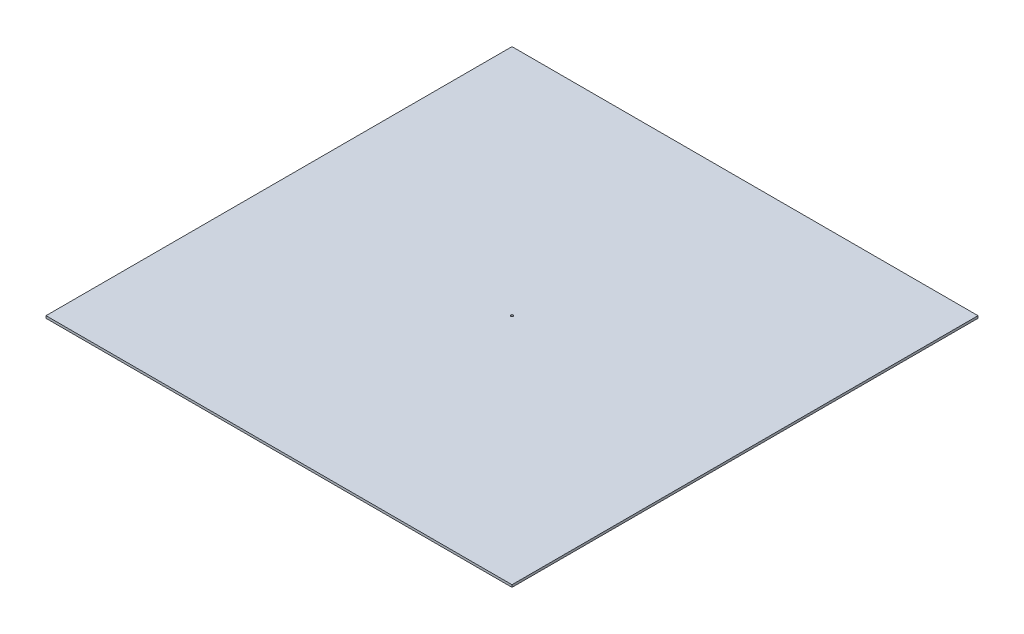
ISO-10303-21;
HEADER;
FILE_DESCRIPTION(('STEP AP214'),'2;1');
FILE_NAME('part.step','',(''),(''),'','','');
FILE_SCHEMA(('AUTOMOTIVE_DESIGN { 1 0 10303 214 1 1 1 1 }'));
ENDSEC;
DATA;
#1=APPLICATION_CONTEXT('core data for automotive mechanical design processes');
#2=APPLICATION_PROTOCOL_DEFINITION('international standard','automotive_design',2000,#1);
#3=PRODUCT_CONTEXT('',#1,'mechanical');
#4=PRODUCT('Part','Part','',(#3));
#5=PRODUCT_RELATED_PRODUCT_CATEGORY('part','',(#4));
#6=PRODUCT_DEFINITION_FORMATION('','',#4);
#7=PRODUCT_DEFINITION_CONTEXT('part definition',#1,'design');
#8=PRODUCT_DEFINITION('design','',#6,#7);
#9=PRODUCT_DEFINITION_SHAPE('','',#8);
#10=(LENGTH_UNIT() NAMED_UNIT(*) SI_UNIT(.MILLI.,.METRE.));
#11=(NAMED_UNIT(*) PLANE_ANGLE_UNIT() SI_UNIT($,.RADIAN.));
#12=(NAMED_UNIT(*) SI_UNIT($,.STERADIAN.) SOLID_ANGLE_UNIT());
#13=UNCERTAINTY_MEASURE_WITH_UNIT(LENGTH_MEASURE(1.E-05),#10,'distance_accuracy_value','');
#14=(GEOMETRIC_REPRESENTATION_CONTEXT(3) GLOBAL_UNCERTAINTY_ASSIGNED_CONTEXT((#13)) GLOBAL_UNIT_ASSIGNED_CONTEXT((#10,
#11,#12)) REPRESENTATION_CONTEXT('',''));
#15=CARTESIAN_POINT('',(0.,0.,0.));
#16=DIRECTION('',(0.,0.,1.));
#17=DIRECTION('',(1.,0.,0.));
#18=AXIS2_PLACEMENT_3D('',#15,#16,#17);
#19=CARTESIAN_POINT('',(1000.,10.,-1000.));
#20=DIRECTION('',(-1.,0.,0.));
#21=DIRECTION('',(0.,0.,1.));
#22=AXIS2_PLACEMENT_3D('',#19,#20,#21);
#23=PLANE('',#22);
#24=DIRECTION('',(0.,0.,-1.));
#25=VECTOR('',#24,1.);
#26=CARTESIAN_POINT('',(1000.,0.,-1000.));
#27=LINE('',#26,#25);
#28=CARTESIAN_POINT('',(1000.,0.,1000.));
#29=VERTEX_POINT('',#28);
#30=CARTESIAN_POINT('',(1000.,0.,-1000.));
#31=VERTEX_POINT('',#30);
#32=EDGE_CURVE('E96',#29,#31,#27,.T.);
#33=ORIENTED_EDGE('',*,*,#32,.T.);
#34=DIRECTION('',(0.,-1.,0.));
#35=VECTOR('',#34,1.);
#36=CARTESIAN_POINT('',(1000.,10.,-1000.));
#37=LINE('',#36,#35);
#38=CARTESIAN_POINT('',(1000.,10.,-1000.));
#39=VERTEX_POINT('',#38);
#40=EDGE_CURVE('E11',#39,#31,#37,.T.);
#41=ORIENTED_EDGE('',*,*,#40,.F.);
#42=DIRECTION('',(0.,0.,-1.));
#43=VECTOR('',#42,1.);
#44=CARTESIAN_POINT('',(1000.,10.,-1000.));
#45=LINE('',#44,#43);
#46=CARTESIAN_POINT('',(1000.,10.,1000.));
#47=VERTEX_POINT('',#46);
#48=EDGE_CURVE('E84',#47,#39,#45,.T.);
#49=ORIENTED_EDGE('',*,*,#48,.F.);
#50=DIRECTION('',(0.,-1.,0.));
#51=VECTOR('',#50,1.);
#52=CARTESIAN_POINT('',(1000.,10.,1000.));
#53=LINE('',#52,#51);
#54=EDGE_CURVE('E92',#47,#29,#53,.T.);
#55=ORIENTED_EDGE('',*,*,#54,.T.);
#56=EDGE_LOOP('',(#33,#41,#49,#55));
#57=FACE_BOUND('',#56,.T.);
#58=ADVANCED_FACE('F33',(#57),#23,.F.);
#59=CARTESIAN_POINT('',(-1000.,10.,-1000.));
#60=DIRECTION('',(0.,0.,1.));
#61=DIRECTION('',(1.,0.,0.));
#62=AXIS2_PLACEMENT_3D('',#59,#60,#61);
#63=PLANE('',#62);
#64=DIRECTION('',(-1.,0.,0.));
#65=VECTOR('',#64,1.);
#66=CARTESIAN_POINT('',(-1000.,0.,-1000.));
#67=LINE('',#66,#65);
#68=CARTESIAN_POINT('',(-1000.,0.,-1000.));
#69=VERTEX_POINT('',#68);
#70=EDGE_CURVE('E88',#31,#69,#67,.T.);
#71=ORIENTED_EDGE('',*,*,#70,.T.);
#72=DIRECTION('',(0.,-1.,0.));
#73=VECTOR('',#72,1.);
#74=CARTESIAN_POINT('',(-1000.,10.,-1000.));
#75=LINE('',#74,#73);
#76=CARTESIAN_POINT('',(-1000.,10.,-1000.));
#77=VERTEX_POINT('',#76);
#78=EDGE_CURVE('E41',#77,#69,#75,.T.);
#79=ORIENTED_EDGE('',*,*,#78,.F.);
#80=DIRECTION('',(-1.,0.,0.));
#81=VECTOR('',#80,1.);
#82=CARTESIAN_POINT('',(-1000.,10.,-1000.));
#83=LINE('',#82,#81);
#84=EDGE_CURVE('E79',#39,#77,#83,.T.);
#85=ORIENTED_EDGE('',*,*,#84,.F.);
#86=ORIENTED_EDGE('',*,*,#40,.T.);
#87=EDGE_LOOP('',(#71,#79,#85,#86));
#88=FACE_BOUND('',#87,.T.);
#89=ADVANCED_FACE('F87',(#88),#63,.F.);
#90=CARTESIAN_POINT('',(-1000.,10.,-1000.));
#91=DIRECTION('',(1.,0.,0.));
#92=DIRECTION('',(0.,0.,-1.));
#93=AXIS2_PLACEMENT_3D('',#90,#91,#92);
#94=PLANE('',#93);
#95=DIRECTION('',(0.,0.,1.));
#96=VECTOR('',#95,1.);
#97=CARTESIAN_POINT('',(-1000.,0.,-1000.));
#98=LINE('',#97,#96);
#99=CARTESIAN_POINT('',(-1000.,0.,1000.));
#100=VERTEX_POINT('',#99);
#101=EDGE_CURVE('E66',#69,#100,#98,.T.);
#102=ORIENTED_EDGE('',*,*,#101,.T.);
#103=DIRECTION('',(0.,-1.,0.));
#104=VECTOR('',#103,1.);
#105=CARTESIAN_POINT('',(-1000.,10.,1000.));
#106=LINE('',#105,#104);
#107=CARTESIAN_POINT('',(-1000.,10.,1000.));
#108=VERTEX_POINT('',#107);
#109=EDGE_CURVE('E89',#108,#100,#106,.T.);
#110=ORIENTED_EDGE('',*,*,#109,.F.);
#111=DIRECTION('',(0.,0.,1.));
#112=VECTOR('',#111,1.);
#113=CARTESIAN_POINT('',(-1000.,10.,-1000.));
#114=LINE('',#113,#112);
#115=EDGE_CURVE('E82',#77,#108,#114,.T.);
#116=ORIENTED_EDGE('',*,*,#115,.F.);
#117=ORIENTED_EDGE('',*,*,#78,.T.);
#118=EDGE_LOOP('',(#102,#110,#116,#117));
#119=FACE_BOUND('',#118,.T.);
#120=ADVANCED_FACE('F90',(#119),#94,.F.);
#121=CARTESIAN_POINT('',(-1000.,10.,1000.));
#122=DIRECTION('',(0.,0.,-1.));
#123=DIRECTION('',(-1.,0.,0.));
#124=AXIS2_PLACEMENT_3D('',#121,#122,#123);
#125=PLANE('',#124);
#126=DIRECTION('',(1.,0.,0.));
#127=VECTOR('',#126,1.);
#128=CARTESIAN_POINT('',(-1000.,0.,1000.));
#129=LINE('',#128,#127);
#130=EDGE_CURVE('E72',#100,#29,#129,.T.);
#131=ORIENTED_EDGE('',*,*,#130,.T.);
#132=ORIENTED_EDGE('',*,*,#54,.F.);
#133=DIRECTION('',(1.,0.,0.));
#134=VECTOR('',#133,1.);
#135=CARTESIAN_POINT('',(-1000.,10.,1000.));
#136=LINE('',#135,#134);
#137=EDGE_CURVE('E49',#108,#47,#136,.T.);
#138=ORIENTED_EDGE('',*,*,#137,.F.);
#139=ORIENTED_EDGE('',*,*,#109,.T.);
#140=EDGE_LOOP('',(#131,#132,#138,#139));
#141=FACE_BOUND('',#140,.T.);
#142=ADVANCED_FACE('F104',(#141),#125,.F.);
#143=CARTESIAN_POINT('',(0.,10.,0.));
#144=DIRECTION('',(0.,1.,0.));
#145=DIRECTION('',(0.,0.,1.));
#146=AXIS2_PLACEMENT_3D('',#143,#144,#145);
#147=PLANE('',#146);
#148=CARTESIAN_POINT('',(0.,10.,0.));
#149=DIRECTION('',(0.,1.,0.));
#150=DIRECTION('',(0.,0.,1.));
#151=AXIS2_PLACEMENT_3D('',#148,#149,#150);
#152=CIRCLE('',#151,5.);
#153=CARTESIAN_POINT('',(0.,10.,5.));
#154=VERTEX_POINT('',#153);
#155=EDGE_CURVE('E110',#154,#154,#152,.T.);
#156=ORIENTED_EDGE('',*,*,#155,.F.);
#157=EDGE_LOOP('',(#156));
#158=FACE_BOUND('',#157,.T.);
#159=ORIENTED_EDGE('',*,*,#48,.T.);
#160=ORIENTED_EDGE('',*,*,#84,.T.);
#161=ORIENTED_EDGE('',*,*,#115,.T.);
#162=ORIENTED_EDGE('',*,*,#137,.T.);
#163=EDGE_LOOP('',(#159,#160,#161,#162));
#164=FACE_BOUND('',#163,.T.);
#165=ADVANCED_FACE('F80',(#158,#164),#147,.T.);
#166=CARTESIAN_POINT('',(0.,0.,0.));
#167=DIRECTION('',(0.,1.,0.));
#168=DIRECTION('',(0.,0.,1.));
#169=AXIS2_PLACEMENT_3D('',#166,#167,#168);
#170=PLANE('',#169);
#171=CARTESIAN_POINT('',(0.,0.,0.));
#172=DIRECTION('',(0.,1.,0.));
#173=DIRECTION('',(0.,0.,1.));
#174=AXIS2_PLACEMENT_3D('',#171,#172,#173);
#175=CIRCLE('',#174,5.);
#176=CARTESIAN_POINT('',(0.,0.,5.));
#177=VERTEX_POINT('',#176);
#178=EDGE_CURVE('E99',#177,#177,#175,.T.);
#179=ORIENTED_EDGE('',*,*,#178,.T.);
#180=EDGE_LOOP('',(#179));
#181=FACE_BOUND('',#180,.T.);
#182=ORIENTED_EDGE('',*,*,#32,.F.);
#183=ORIENTED_EDGE('',*,*,#130,.F.);
#184=ORIENTED_EDGE('',*,*,#101,.F.);
#185=ORIENTED_EDGE('',*,*,#70,.F.);
#186=EDGE_LOOP('',(#182,#183,#184,#185));
#187=FACE_BOUND('',#186,.T.);
#188=ADVANCED_FACE('F107',(#181,#187),#170,.F.);
#189=CARTESIAN_POINT('',(0.,0.,0.));
#190=DIRECTION('',(0.,1.,0.));
#191=DIRECTION('',(0.,0.,1.));
#192=AXIS2_PLACEMENT_3D('',#189,#190,#191);
#193=CYLINDRICAL_SURFACE('',#192,5.);
#194=ORIENTED_EDGE('',*,*,#178,.F.);
#195=EDGE_LOOP('',(#194));
#196=FACE_BOUND('',#195,.T.);
#197=ORIENTED_EDGE('',*,*,#155,.T.);
#198=EDGE_LOOP('',(#197));
#199=FACE_BOUND('',#198,.T.);
#200=ADVANCED_FACE('F117',(#196,#199),#193,.F.);
#201=CLOSED_SHELL('',(#58,#89,#120,#142,#165,#188,#200));
#202=MANIFOLD_SOLID_BREP('B2',#201);
#203=ADVANCED_BREP_SHAPE_REPRESENTATION('',(#18,#202),#14);
#204=SHAPE_DEFINITION_REPRESENTATION(#9,#203);
ENDSEC;
END-ISO-10303-21;
